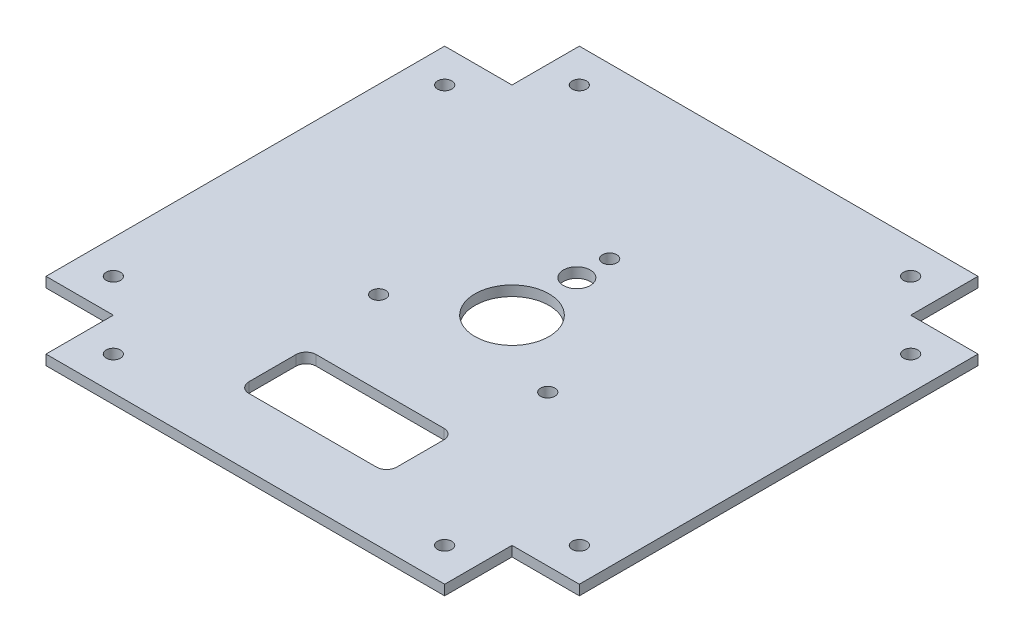
ISO-10303-21;
HEADER;
FILE_DESCRIPTION(('STEP AP214'),'2;1');
FILE_NAME('part.step','',(''),(''),'','','');
FILE_SCHEMA(('AUTOMOTIVE_DESIGN { 1 0 10303 214 1 1 1 1 }'));
ENDSEC;
DATA;
#1=APPLICATION_CONTEXT('core data for automotive mechanical design processes');
#2=APPLICATION_PROTOCOL_DEFINITION('international standard','automotive_design',2000,#1);
#3=PRODUCT_CONTEXT('',#1,'mechanical');
#4=PRODUCT('Part','Part','',(#3));
#5=PRODUCT_RELATED_PRODUCT_CATEGORY('part','',(#4));
#6=PRODUCT_DEFINITION_FORMATION('','',#4);
#7=PRODUCT_DEFINITION_CONTEXT('part definition',#1,'design');
#8=PRODUCT_DEFINITION('design','',#6,#7);
#9=PRODUCT_DEFINITION_SHAPE('','',#8);
#10=(LENGTH_UNIT() NAMED_UNIT(*) SI_UNIT(.MILLI.,.METRE.));
#11=(NAMED_UNIT(*) PLANE_ANGLE_UNIT() SI_UNIT($,.RADIAN.));
#12=(NAMED_UNIT(*) SI_UNIT($,.STERADIAN.) SOLID_ANGLE_UNIT());
#13=UNCERTAINTY_MEASURE_WITH_UNIT(LENGTH_MEASURE(1.E-05),#10,'distance_accuracy_value','');
#14=(GEOMETRIC_REPRESENTATION_CONTEXT(3) GLOBAL_UNCERTAINTY_ASSIGNED_CONTEXT((#13)) GLOBAL_UNIT_ASSIGNED_CONTEXT((#10,
#11,#12)) REPRESENTATION_CONTEXT('',''));
#15=CARTESIAN_POINT('',(0.,0.,0.));
#16=DIRECTION('',(0.,0.,1.));
#17=DIRECTION('',(1.,0.,0.));
#18=AXIS2_PLACEMENT_3D('',#15,#16,#17);
#19=CARTESIAN_POINT('',(79.2,3.,79.2));
#20=DIRECTION('',(-1.,0.,0.));
#21=DIRECTION('',(0.,0.,1.));
#22=AXIS2_PLACEMENT_3D('',#19,#20,#21);
#23=PLANE('',#22);
#24=DIRECTION('',(0.,0.,-1.));
#25=VECTOR('',#24,1.);
#26=CARTESIAN_POINT('',(79.2,3.,79.2));
#27=LINE('',#26,#25);
#28=CARTESIAN_POINT('',(79.2000000000017,3.,59.1999999999984));
#29=VERTEX_POINT('',#28);
#30=CARTESIAN_POINT('',(79.2,3.,-59.2000000000017));
#31=VERTEX_POINT('',#30);
#32=EDGE_CURVE('E202',#29,#31,#27,.T.);
#33=ORIENTED_EDGE('',*,*,#32,.F.);
#34=DIRECTION('',(0.,1.,0.));
#35=VECTOR('',#34,1.);
#36=CARTESIAN_POINT('',(79.2000000000017,0.,59.1999999999984));
#37=LINE('',#36,#35);
#38=CARTESIAN_POINT('',(79.2000000000017,0.,59.1999999999984));
#39=VERTEX_POINT('',#38);
#40=EDGE_CURVE('E547',#39,#29,#37,.T.);
#41=ORIENTED_EDGE('',*,*,#40,.F.);
#42=DIRECTION('',(0.,0.,-1.));
#43=VECTOR('',#42,1.);
#44=CARTESIAN_POINT('',(79.2,0.,79.2));
#45=LINE('',#44,#43);
#46=CARTESIAN_POINT('',(79.2,0.,-59.2000000000017));
#47=VERTEX_POINT('',#46);
#48=EDGE_CURVE('E204',#39,#47,#45,.T.);
#49=ORIENTED_EDGE('',*,*,#48,.T.);
#50=DIRECTION('',(0.,1.,0.));
#51=VECTOR('',#50,1.);
#52=CARTESIAN_POINT('',(79.2,0.,-59.2000000000017));
#53=LINE('',#52,#51);
#54=EDGE_CURVE('E186',#47,#31,#53,.T.);
#55=ORIENTED_EDGE('',*,*,#54,.T.);
#56=EDGE_LOOP('',(#33,#41,#49,#55));
#57=FACE_BOUND('',#56,.T.);
#58=ADVANCED_FACE('F45',(#57),#23,.F.);
#59=CARTESIAN_POINT('',(-79.2,3.,-79.2));
#60=DIRECTION('',(0.,0.,1.));
#61=DIRECTION('',(1.,0.,0.));
#62=AXIS2_PLACEMENT_3D('',#59,#60,#61);
#63=PLANE('',#62);
#64=DIRECTION('',(-1.,0.,0.));
#65=VECTOR('',#64,1.);
#66=CARTESIAN_POINT('',(-79.2,3.,-79.2));
#67=LINE('',#66,#65);
#68=CARTESIAN_POINT('',(59.2,3.,-79.2000000000017));
#69=VERTEX_POINT('',#68);
#70=CARTESIAN_POINT('',(-59.2,3.,-79.2));
#71=VERTEX_POINT('',#70);
#72=EDGE_CURVE('E214',#69,#71,#67,.T.);
#73=ORIENTED_EDGE('',*,*,#72,.F.);
#74=DIRECTION('',(0.,1.,0.));
#75=VECTOR('',#74,1.);
#76=CARTESIAN_POINT('',(59.2,0.,-79.2000000000017));
#77=LINE('',#76,#75);
#78=CARTESIAN_POINT('',(59.2,0.,-79.2000000000017));
#79=VERTEX_POINT('',#78);
#80=EDGE_CURVE('E566',#79,#69,#77,.T.);
#81=ORIENTED_EDGE('',*,*,#80,.F.);
#82=DIRECTION('',(-1.,0.,0.));
#83=VECTOR('',#82,1.);
#84=CARTESIAN_POINT('',(-79.2,0.,-79.2));
#85=LINE('',#84,#83);
#86=CARTESIAN_POINT('',(-59.2,0.,-79.2));
#87=VERTEX_POINT('',#86);
#88=EDGE_CURVE('E238',#79,#87,#85,.T.);
#89=ORIENTED_EDGE('',*,*,#88,.T.);
#90=DIRECTION('',(0.,1.,0.));
#91=VECTOR('',#90,1.);
#92=CARTESIAN_POINT('',(-59.2,0.,-79.2));
#93=LINE('',#92,#91);
#94=EDGE_CURVE('E322',#87,#71,#93,.T.);
#95=ORIENTED_EDGE('',*,*,#94,.T.);
#96=EDGE_LOOP('',(#73,#81,#89,#95));
#97=FACE_BOUND('',#96,.T.);
#98=ADVANCED_FACE('F419',(#97),#63,.F.);
#99=CARTESIAN_POINT('',(-79.2,3.,79.2));
#100=DIRECTION('',(1.,0.,0.));
#101=DIRECTION('',(0.,0.,-1.));
#102=AXIS2_PLACEMENT_3D('',#99,#100,#101);
#103=PLANE('',#102);
#104=DIRECTION('',(0.,0.,1.));
#105=VECTOR('',#104,1.);
#106=CARTESIAN_POINT('',(-79.2,0.,79.2));
#107=LINE('',#106,#105);
#108=CARTESIAN_POINT('',(-79.2,0.,-59.2));
#109=VERTEX_POINT('',#108);
#110=CARTESIAN_POINT('',(-79.1999999999984,0.,59.2));
#111=VERTEX_POINT('',#110);
#112=EDGE_CURVE('E223',#109,#111,#107,.T.);
#113=ORIENTED_EDGE('',*,*,#112,.T.);
#114=DIRECTION('',(0.,1.,0.));
#115=VECTOR('',#114,1.);
#116=CARTESIAN_POINT('',(-79.1999999999984,0.,59.2));
#117=LINE('',#116,#115);
#118=CARTESIAN_POINT('',(-79.1999999999984,3.,59.2));
#119=VERTEX_POINT('',#118);
#120=EDGE_CURVE('E529',#111,#119,#117,.T.);
#121=ORIENTED_EDGE('',*,*,#120,.T.);
#122=DIRECTION('',(0.,0.,1.));
#123=VECTOR('',#122,1.);
#124=CARTESIAN_POINT('',(-79.2,3.,79.2));
#125=LINE('',#124,#123);
#126=CARTESIAN_POINT('',(-79.2,3.,-59.2));
#127=VERTEX_POINT('',#126);
#128=EDGE_CURVE('E220',#127,#119,#125,.T.);
#129=ORIENTED_EDGE('',*,*,#128,.F.);
#130=DIRECTION('',(0.,1.,0.));
#131=VECTOR('',#130,1.);
#132=CARTESIAN_POINT('',(-79.2,0.,-59.2));
#133=LINE('',#132,#131);
#134=EDGE_CURVE('E488',#109,#127,#133,.T.);
#135=ORIENTED_EDGE('',*,*,#134,.F.);
#136=EDGE_LOOP('',(#113,#121,#129,#135));
#137=FACE_BOUND('',#136,.T.);
#138=ADVANCED_FACE('F412',(#137),#103,.F.);
#139=CARTESIAN_POINT('',(-79.2,3.,79.2));
#140=DIRECTION('',(0.,0.,-1.));
#141=DIRECTION('',(-1.,0.,0.));
#142=AXIS2_PLACEMENT_3D('',#139,#140,#141);
#143=PLANE('',#142);
#144=DIRECTION('',(1.,0.,0.));
#145=VECTOR('',#144,1.);
#146=CARTESIAN_POINT('',(-79.2,3.,79.2));
#147=LINE('',#146,#145);
#148=CARTESIAN_POINT('',(-59.1999999999984,3.,79.2));
#149=VERTEX_POINT('',#148);
#150=CARTESIAN_POINT('',(59.2000000000017,3.,79.1999999999984));
#151=VERTEX_POINT('',#150);
#152=EDGE_CURVE('E231',#149,#151,#147,.T.);
#153=ORIENTED_EDGE('',*,*,#152,.F.);
#154=DIRECTION('',(0.,1.,0.));
#155=VECTOR('',#154,1.);
#156=CARTESIAN_POINT('',(-59.1999999999984,0.,79.2));
#157=LINE('',#156,#155);
#158=CARTESIAN_POINT('',(-59.1999999999984,0.,79.2));
#159=VERTEX_POINT('',#158);
#160=EDGE_CURVE('E521',#159,#149,#157,.T.);
#161=ORIENTED_EDGE('',*,*,#160,.F.);
#162=DIRECTION('',(1.,0.,0.));
#163=VECTOR('',#162,1.);
#164=CARTESIAN_POINT('',(-79.2,0.,79.2));
#165=LINE('',#164,#163);
#166=CARTESIAN_POINT('',(59.2000000000017,0.,79.1999999999984));
#167=VERTEX_POINT('',#166);
#168=EDGE_CURVE('E215',#159,#167,#165,.T.);
#169=ORIENTED_EDGE('',*,*,#168,.T.);
#170=DIRECTION('',(0.,1.,0.));
#171=VECTOR('',#170,1.);
#172=CARTESIAN_POINT('',(59.2000000000017,0.,79.1999999999984));
#173=LINE('',#172,#171);
#174=EDGE_CURVE('E526',#167,#151,#173,.T.);
#175=ORIENTED_EDGE('',*,*,#174,.T.);
#176=EDGE_LOOP('',(#153,#161,#169,#175));
#177=FACE_BOUND('',#176,.T.);
#178=ADVANCED_FACE('F402',(#177),#143,.F.);
#179=CARTESIAN_POINT('',(0.,3.,0.));
#180=DIRECTION('',(0.,-1.,0.));
#181=DIRECTION('',(0.,0.,-1.));
#182=AXIS2_PLACEMENT_3D('',#179,#180,#181);
#183=PLANE('',#182);
#184=CARTESIAN_POINT('',(-49.1999999999999,3.,69.1999999999995));
#185=DIRECTION('',(0.,1.,0.));
#186=DIRECTION('',(0.,0.,-1.));
#187=AXIS2_PLACEMENT_3D('',#184,#185,#186);
#188=CIRCLE('',#187,2.12500000000001);
#189=CARTESIAN_POINT('',(-49.1999999999999,3.,67.0749999999994));
#190=VERTEX_POINT('',#189);
#191=EDGE_CURVE('E354',#190,#190,#188,.T.);
#192=ORIENTED_EDGE('',*,*,#191,.F.);
#193=EDGE_LOOP('',(#192));
#194=FACE_BOUND('',#193,.T.);
#195=CARTESIAN_POINT('',(49.2000000000002,3.,69.2));
#196=DIRECTION('',(0.,1.,0.));
#197=DIRECTION('',(0.,0.,1.));
#198=AXIS2_PLACEMENT_3D('',#195,#196,#197);
#199=CIRCLE('',#198,2.125);
#200=CARTESIAN_POINT('',(49.2000000000002,3.,71.325));
#201=VERTEX_POINT('',#200);
#202=EDGE_CURVE('E346',#201,#201,#199,.T.);
#203=ORIENTED_EDGE('',*,*,#202,.F.);
#204=EDGE_LOOP('',(#203));
#205=FACE_BOUND('',#204,.T.);
#206=CARTESIAN_POINT('',(69.1999999999997,3.,49.1999999999996));
#207=DIRECTION('',(0.,1.,0.));
#208=DIRECTION('',(0.,0.,-1.));
#209=AXIS2_PLACEMENT_3D('',#206,#207,#208);
#210=CIRCLE('',#209,2.12499999999999);
#211=CARTESIAN_POINT('',(69.1999999999997,3.,47.0749999999997));
#212=VERTEX_POINT('',#211);
#213=EDGE_CURVE('E338',#212,#212,#210,.T.);
#214=ORIENTED_EDGE('',*,*,#213,.F.);
#215=EDGE_LOOP('',(#214));
#216=FACE_BOUND('',#215,.T.);
#217=CARTESIAN_POINT('',(69.2,3.,-49.2000000000012));
#218=DIRECTION('',(0.,1.,0.));
#219=DIRECTION('',(0.,0.,1.));
#220=AXIS2_PLACEMENT_3D('',#217,#218,#219);
#221=CIRCLE('',#220,2.12500000000035);
#222=CARTESIAN_POINT('',(69.2,3.,-47.0750000000008));
#223=VERTEX_POINT('',#222);
#224=EDGE_CURVE('E329',#223,#223,#221,.T.);
#225=ORIENTED_EDGE('',*,*,#224,.F.);
#226=EDGE_LOOP('',(#225));
#227=FACE_BOUND('',#226,.T.);
#228=CARTESIAN_POINT('',(49.1999999999994,3.,-69.1999999999998));
#229=DIRECTION('',(0.,1.,0.));
#230=DIRECTION('',(0.,0.,-1.));
#231=AXIS2_PLACEMENT_3D('',#228,#229,#230);
#232=CIRCLE('',#231,2.125);
#233=CARTESIAN_POINT('',(49.1999999999994,3.,-71.3249999999998));
#234=VERTEX_POINT('',#233);
#235=EDGE_CURVE('E387',#234,#234,#232,.T.);
#236=ORIENTED_EDGE('',*,*,#235,.F.);
#237=EDGE_LOOP('',(#236));
#238=FACE_BOUND('',#237,.T.);
#239=CARTESIAN_POINT('',(-49.2000000000012,3.,-69.2));
#240=DIRECTION('',(0.,1.,0.));
#241=DIRECTION('',(0.,0.,1.));
#242=AXIS2_PLACEMENT_3D('',#239,#240,#241);
#243=CIRCLE('',#242,2.12500000000047);
#244=CARTESIAN_POINT('',(-49.2000000000012,3.,-67.0749999999995));
#245=VERTEX_POINT('',#244);
#246=EDGE_CURVE('E379',#245,#245,#243,.T.);
#247=ORIENTED_EDGE('',*,*,#246,.F.);
#248=EDGE_LOOP('',(#247));
#249=FACE_BOUND('',#248,.T.);
#250=CARTESIAN_POINT('',(0.,3.,0.));
#251=DIRECTION('',(0.,1.,0.));
#252=DIRECTION('',(0.,0.,1.));
#253=AXIS2_PLACEMENT_3D('',#250,#251,#252);
#254=CIRCLE('',#253,11.);
#255=CARTESIAN_POINT('',(0.,3.,11.));
#256=VERTEX_POINT('',#255);
#257=EDGE_CURVE('E371',#256,#256,#254,.T.);
#258=ORIENTED_EDGE('',*,*,#257,.F.);
#259=EDGE_LOOP('',(#258));
#260=FACE_BOUND('',#259,.T.);
#261=CARTESIAN_POINT('',(-69.2,3.,-49.2000000000012));
#262=DIRECTION('',(0.,1.,0.));
#263=DIRECTION('',(0.,0.,-1.));
#264=AXIS2_PLACEMENT_3D('',#261,#262,#263);
#265=CIRCLE('',#264,2.12500000000057);
#266=CARTESIAN_POINT('',(-69.2,3.,-51.3250000000017));
#267=VERTEX_POINT('',#266);
#268=EDGE_CURVE('E363',#267,#267,#265,.T.);
#269=ORIENTED_EDGE('',*,*,#268,.F.);
#270=EDGE_LOOP('',(#269));
#271=FACE_BOUND('',#270,.T.);
#272=CARTESIAN_POINT('',(0.,3.,-29.));
#273=DIRECTION('',(0.,1.,0.));
#274=DIRECTION('',(0.,0.,1.));
#275=AXIS2_PLACEMENT_3D('',#272,#273,#274);
#276=CIRCLE('',#275,2.125);
#277=CARTESIAN_POINT('',(0.,3.,-26.875));
#278=VERTEX_POINT('',#277);
#279=EDGE_CURVE('E362',#278,#278,#276,.T.);
#280=ORIENTED_EDGE('',*,*,#279,.F.);
#281=EDGE_LOOP('',(#280));
#282=FACE_BOUND('',#281,.T.);
#283=CARTESIAN_POINT('',(0.,3.,-19.25));
#284=DIRECTION('',(0.,1.,0.));
#285=DIRECTION('',(0.,0.,1.));
#286=AXIS2_PLACEMENT_3D('',#283,#284,#285);
#287=CIRCLE('',#286,4.);
#288=CARTESIAN_POINT('',(0.,3.,-15.25));
#289=VERTEX_POINT('',#288);
#290=EDGE_CURVE('E477',#289,#289,#287,.T.);
#291=ORIENTED_EDGE('',*,*,#290,.F.);
#292=EDGE_LOOP('',(#291));
#293=FACE_BOUND('',#292,.T.);
#294=CARTESIAN_POINT('',(25.1147367097506,3.,14.4999999999989));
#295=DIRECTION('',(0.,1.,0.));
#296=DIRECTION('',(0.,0.,1.));
#297=AXIS2_PLACEMENT_3D('',#294,#295,#296);
#298=CIRCLE('',#297,2.12500000000159);
#299=CARTESIAN_POINT('',(25.1147367097506,3.,16.6250000000005));
#300=VERTEX_POINT('',#299);
#301=EDGE_CURVE('E469',#300,#300,#298,.T.);
#302=ORIENTED_EDGE('',*,*,#301,.F.);
#303=EDGE_LOOP('',(#302));
#304=FACE_BOUND('',#303,.T.);
#305=CARTESIAN_POINT('',(-25.1147367097469,3.,14.5000000000011));
#306=DIRECTION('',(0.,1.,0.));
#307=DIRECTION('',(0.,0.,1.));
#308=AXIS2_PLACEMENT_3D('',#305,#306,#307);
#309=CIRCLE('',#308,2.12500000000233);
#310=CARTESIAN_POINT('',(-25.1147367097469,3.,16.6250000000034));
#311=VERTEX_POINT('',#310);
#312=EDGE_CURVE('E454',#311,#311,#309,.T.);
#313=ORIENTED_EDGE('',*,*,#312,.F.);
#314=EDGE_LOOP('',(#313));
#315=FACE_BOUND('',#314,.T.);
#316=DIRECTION('',(-1.,0.,0.));
#317=VECTOR('',#316,1.);
#318=CARTESIAN_POINT('',(-21.955986131949,3.,39.2000000000019));
#319=LINE('',#318,#317);
#320=CARTESIAN_POINT('',(18.9559861319399,3.,39.2000000000019));
#321=VERTEX_POINT('',#320);
#322=CARTESIAN_POINT('',(-18.955986131949,3.,39.2000000000019));
#323=VERTEX_POINT('',#322);
#324=EDGE_CURVE('E293',#321,#323,#319,.T.);
#325=ORIENTED_EDGE('',*,*,#324,.F.);
#326=CARTESIAN_POINT('',(18.9559861319399,3.,42.2000000000019));
#327=DIRECTION('',(0.,-1.,0.));
#328=DIRECTION('',(0.,0.,-1.));
#329=AXIS2_PLACEMENT_3D('',#326,#327,#328);
#330=CIRCLE('',#329,3.);
#331=CARTESIAN_POINT('',(21.9559861319399,3.,42.2000000000019));
#332=VERTEX_POINT('',#331);
#333=EDGE_CURVE('E284',#321,#332,#330,.T.);
#334=ORIENTED_EDGE('',*,*,#333,.T.);
#335=DIRECTION('',(0.,0.,-1.));
#336=VECTOR('',#335,1.);
#337=CARTESIAN_POINT('',(21.9559861319399,3.,59.2000000000019));
#338=LINE('',#337,#336);
#339=CARTESIAN_POINT('',(21.9559861319399,3.,56.2000000000019));
#340=VERTEX_POINT('',#339);
#341=EDGE_CURVE('E301',#340,#332,#338,.T.);
#342=ORIENTED_EDGE('',*,*,#341,.F.);
#343=CARTESIAN_POINT('',(18.9559861319399,3.,56.2000000000019));
#344=DIRECTION('',(0.,-1.,0.));
#345=DIRECTION('',(0.,0.,-1.));
#346=AXIS2_PLACEMENT_3D('',#343,#344,#345);
#347=CIRCLE('',#346,3.);
#348=CARTESIAN_POINT('',(18.9559861319399,3.,59.2000000000019));
#349=VERTEX_POINT('',#348);
#350=EDGE_CURVE('E278',#340,#349,#347,.T.);
#351=ORIENTED_EDGE('',*,*,#350,.T.);
#352=DIRECTION('',(1.,0.,0.));
#353=VECTOR('',#352,1.);
#354=CARTESIAN_POINT('',(-21.955986131949,3.,59.2000000000019));
#355=LINE('',#354,#353);
#356=CARTESIAN_POINT('',(-18.955986131949,3.,59.2000000000019));
#357=VERTEX_POINT('',#356);
#358=EDGE_CURVE('E328',#357,#349,#355,.T.);
#359=ORIENTED_EDGE('',*,*,#358,.F.);
#360=CARTESIAN_POINT('',(-18.955986131949,3.,56.2000000000019));
#361=DIRECTION('',(0.,-1.,0.));
#362=DIRECTION('',(0.,0.,-1.));
#363=AXIS2_PLACEMENT_3D('',#360,#361,#362);
#364=CIRCLE('',#363,3.);
#365=CARTESIAN_POINT('',(-21.955986131949,3.,56.2000000000019));
#366=VERTEX_POINT('',#365);
#367=EDGE_CURVE('E272',#357,#366,#364,.T.);
#368=ORIENTED_EDGE('',*,*,#367,.T.);
#369=DIRECTION('',(0.,0.,1.));
#370=VECTOR('',#369,1.);
#371=CARTESIAN_POINT('',(-21.955986131949,3.,59.2000000000019));
#372=LINE('',#371,#370);
#373=CARTESIAN_POINT('',(-21.955986131949,3.,42.2000000000019));
#374=VERTEX_POINT('',#373);
#375=EDGE_CURVE('E295',#374,#366,#372,.T.);
#376=ORIENTED_EDGE('',*,*,#375,.F.);
#377=CARTESIAN_POINT('',(-18.955986131949,3.,42.2000000000019));
#378=DIRECTION('',(0.,-1.,0.));
#379=DIRECTION('',(0.,0.,-1.));
#380=AXIS2_PLACEMENT_3D('',#377,#378,#379);
#381=CIRCLE('',#380,3.);
#382=EDGE_CURVE('E54',#374,#323,#381,.T.);
#383=ORIENTED_EDGE('',*,*,#382,.T.);
#384=EDGE_LOOP('',(#325,#334,#342,#351,#359,#368,#376,#383));
#385=FACE_BOUND('',#384,.T.);
#386=CARTESIAN_POINT('',(-69.2,3.,49.2000000000012));
#387=DIRECTION('',(0.,1.,0.));
#388=DIRECTION('',(0.,0.,1.));
#389=AXIS2_PLACEMENT_3D('',#386,#387,#388);
#390=CIRCLE('',#389,2.12500000000056);
#391=CARTESIAN_POINT('',(-69.2,3.,51.3250000000017));
#392=VERTEX_POINT('',#391);
#393=EDGE_CURVE('E226',#392,#392,#390,.T.);
#394=ORIENTED_EDGE('',*,*,#393,.F.);
#395=EDGE_LOOP('',(#394));
#396=FACE_BOUND('',#395,.T.);
#397=ORIENTED_EDGE('',*,*,#128,.T.);
#398=DIRECTION('',(-1.,0.,0.));
#399=VECTOR('',#398,1.);
#400=CARTESIAN_POINT('',(-79.1999999999984,3.,59.2));
#401=LINE('',#400,#399);
#402=CARTESIAN_POINT('',(-59.1999999999984,3.,59.2));
#403=VERTEX_POINT('',#402);
#404=EDGE_CURVE('E516',#403,#119,#401,.T.);
#405=ORIENTED_EDGE('',*,*,#404,.F.);
#406=DIRECTION('',(0.,0.,-1.));
#407=VECTOR('',#406,1.);
#408=CARTESIAN_POINT('',(-59.1999999999984,3.,79.2));
#409=LINE('',#408,#407);
#410=EDGE_CURVE('E522',#149,#403,#409,.T.);
#411=ORIENTED_EDGE('',*,*,#410,.F.);
#412=ORIENTED_EDGE('',*,*,#152,.T.);
#413=DIRECTION('',(0.,0.,1.));
#414=VECTOR('',#413,1.);
#415=CARTESIAN_POINT('',(59.2000000000017,3.,79.1999999999984));
#416=LINE('',#415,#414);
#417=CARTESIAN_POINT('',(59.2000000000017,3.,59.1999999999984));
#418=VERTEX_POINT('',#417);
#419=EDGE_CURVE('E542',#418,#151,#416,.T.);
#420=ORIENTED_EDGE('',*,*,#419,.F.);
#421=DIRECTION('',(-1.,0.,0.));
#422=VECTOR('',#421,1.);
#423=CARTESIAN_POINT('',(79.2000000000017,3.,59.1999999999984));
#424=LINE('',#423,#422);
#425=EDGE_CURVE('E206',#29,#418,#424,.T.);
#426=ORIENTED_EDGE('',*,*,#425,.F.);
#427=ORIENTED_EDGE('',*,*,#32,.T.);
#428=DIRECTION('',(1.,0.,0.));
#429=VECTOR('',#428,1.);
#430=CARTESIAN_POINT('',(79.2,3.,-59.2000000000017));
#431=LINE('',#430,#429);
#432=CARTESIAN_POINT('',(59.2,3.,-59.2000000000017));
#433=VERTEX_POINT('',#432);
#434=EDGE_CURVE('E183',#433,#31,#431,.T.);
#435=ORIENTED_EDGE('',*,*,#434,.F.);
#436=DIRECTION('',(0.,0.,1.));
#437=VECTOR('',#436,1.);
#438=CARTESIAN_POINT('',(59.2,3.,-79.2000000000017));
#439=LINE('',#438,#437);
#440=EDGE_CURVE('E195',#69,#433,#439,.T.);
#441=ORIENTED_EDGE('',*,*,#440,.F.);
#442=ORIENTED_EDGE('',*,*,#72,.T.);
#443=DIRECTION('',(0.,0.,-1.));
#444=VECTOR('',#443,1.);
#445=CARTESIAN_POINT('',(-59.2,3.,-79.2));
#446=LINE('',#445,#444);
#447=CARTESIAN_POINT('',(-59.2,3.,-59.2));
#448=VERTEX_POINT('',#447);
#449=EDGE_CURVE('E498',#448,#71,#446,.T.);
#450=ORIENTED_EDGE('',*,*,#449,.F.);
#451=DIRECTION('',(1.,0.,0.));
#452=VECTOR('',#451,1.);
#453=CARTESIAN_POINT('',(-79.2,3.,-59.2));
#454=LINE('',#453,#452);
#455=EDGE_CURVE('E502',#127,#448,#454,.T.);
#456=ORIENTED_EDGE('',*,*,#455,.F.);
#457=EDGE_LOOP('',(#397,#405,#411,#412,#420,#426,#427,#435,#441,#442,#450,#456));
#458=FACE_BOUND('',#457,.T.);
#459=ADVANCED_FACE('F210',(#194,#205,#216,#227,#238,#249,#260,#271,#282,#293,#304,#315,#385,
#396,#458),#183,.F.);
#460=CARTESIAN_POINT('',(0.,0.,0.));
#461=DIRECTION('',(0.,-1.,0.));
#462=DIRECTION('',(0.,0.,-1.));
#463=AXIS2_PLACEMENT_3D('',#460,#461,#462);
#464=PLANE('',#463);
#465=DIRECTION('',(-1.,0.,0.));
#466=VECTOR('',#465,1.);
#467=CARTESIAN_POINT('',(-79.1999999999984,0.,59.2));
#468=LINE('',#467,#466);
#469=CARTESIAN_POINT('',(-59.1999999999984,0.,59.2));
#470=VERTEX_POINT('',#469);
#471=EDGE_CURVE('E517',#470,#111,#468,.T.);
#472=ORIENTED_EDGE('',*,*,#471,.T.);
#473=ORIENTED_EDGE('',*,*,#112,.F.);
#474=DIRECTION('',(1.,0.,0.));
#475=VECTOR('',#474,1.);
#476=CARTESIAN_POINT('',(-79.2,0.,-59.2));
#477=LINE('',#476,#475);
#478=CARTESIAN_POINT('',(-59.2,0.,-59.2));
#479=VERTEX_POINT('',#478);
#480=EDGE_CURVE('E501',#109,#479,#477,.T.);
#481=ORIENTED_EDGE('',*,*,#480,.T.);
#482=DIRECTION('',(0.,0.,-1.));
#483=VECTOR('',#482,1.);
#484=CARTESIAN_POINT('',(-59.2,0.,-79.2));
#485=LINE('',#484,#483);
#486=EDGE_CURVE('E492',#479,#87,#485,.T.);
#487=ORIENTED_EDGE('',*,*,#486,.T.);
#488=ORIENTED_EDGE('',*,*,#88,.F.);
#489=DIRECTION('',(0.,0.,1.));
#490=VECTOR('',#489,1.);
#491=CARTESIAN_POINT('',(59.2,0.,-79.2000000000017));
#492=LINE('',#491,#490);
#493=CARTESIAN_POINT('',(59.2,0.,-59.2000000000017));
#494=VERTEX_POINT('',#493);
#495=EDGE_CURVE('E196',#79,#494,#492,.T.);
#496=ORIENTED_EDGE('',*,*,#495,.T.);
#497=DIRECTION('',(1.,0.,0.));
#498=VECTOR('',#497,1.);
#499=CARTESIAN_POINT('',(79.2,0.,-59.2000000000017));
#500=LINE('',#499,#498);
#501=EDGE_CURVE('E563',#494,#47,#500,.T.);
#502=ORIENTED_EDGE('',*,*,#501,.T.);
#503=ORIENTED_EDGE('',*,*,#48,.F.);
#504=DIRECTION('',(-1.,0.,0.));
#505=VECTOR('',#504,1.);
#506=CARTESIAN_POINT('',(79.2000000000017,0.,59.1999999999984));
#507=LINE('',#506,#505);
#508=CARTESIAN_POINT('',(59.2000000000017,0.,59.1999999999984));
#509=VERTEX_POINT('',#508);
#510=EDGE_CURVE('E538',#39,#509,#507,.T.);
#511=ORIENTED_EDGE('',*,*,#510,.T.);
#512=DIRECTION('',(0.,0.,1.));
#513=VECTOR('',#512,1.);
#514=CARTESIAN_POINT('',(59.2000000000017,0.,79.1999999999984));
#515=LINE('',#514,#513);
#516=EDGE_CURVE('E543',#509,#167,#515,.T.);
#517=ORIENTED_EDGE('',*,*,#516,.T.);
#518=ORIENTED_EDGE('',*,*,#168,.F.);
#519=DIRECTION('',(0.,0.,-1.));
#520=VECTOR('',#519,1.);
#521=CARTESIAN_POINT('',(-59.1999999999984,0.,79.2));
#522=LINE('',#521,#520);
#523=EDGE_CURVE('E512',#159,#470,#522,.T.);
#524=ORIENTED_EDGE('',*,*,#523,.T.);
#525=EDGE_LOOP('',(#472,#473,#481,#487,#488,#496,#502,#503,#511,#517,#518,#524));
#526=FACE_BOUND('',#525,.T.);
#527=CARTESIAN_POINT('',(-49.1999999999999,0.,69.1999999999995));
#528=DIRECTION('',(0.,1.,0.));
#529=DIRECTION('',(0.,0.,-1.));
#530=AXIS2_PLACEMENT_3D('',#527,#528,#529);
#531=CIRCLE('',#530,2.12500000000001);
#532=CARTESIAN_POINT('',(-49.1999999999999,0.,67.0749999999994));
#533=VERTEX_POINT('',#532);
#534=EDGE_CURVE('E358',#533,#533,#531,.T.);
#535=ORIENTED_EDGE('',*,*,#534,.T.);
#536=EDGE_LOOP('',(#535));
#537=FACE_BOUND('',#536,.T.);
#538=CARTESIAN_POINT('',(49.2000000000002,0.,69.2));
#539=DIRECTION('',(0.,1.,0.));
#540=DIRECTION('',(0.,0.,1.));
#541=AXIS2_PLACEMENT_3D('',#538,#539,#540);
#542=CIRCLE('',#541,2.125);
#543=CARTESIAN_POINT('',(49.2000000000002,0.,71.325));
#544=VERTEX_POINT('',#543);
#545=EDGE_CURVE('E350',#544,#544,#542,.T.);
#546=ORIENTED_EDGE('',*,*,#545,.T.);
#547=EDGE_LOOP('',(#546));
#548=FACE_BOUND('',#547,.T.);
#549=CARTESIAN_POINT('',(69.1999999999997,0.,49.1999999999996));
#550=DIRECTION('',(0.,1.,0.));
#551=DIRECTION('',(0.,0.,-1.));
#552=AXIS2_PLACEMENT_3D('',#549,#550,#551);
#553=CIRCLE('',#552,2.12499999999999);
#554=CARTESIAN_POINT('',(69.1999999999997,0.,47.0749999999997));
#555=VERTEX_POINT('',#554);
#556=EDGE_CURVE('E342',#555,#555,#553,.T.);
#557=ORIENTED_EDGE('',*,*,#556,.T.);
#558=EDGE_LOOP('',(#557));
#559=FACE_BOUND('',#558,.T.);
#560=CARTESIAN_POINT('',(69.2,0.,-49.2000000000012));
#561=DIRECTION('',(0.,1.,0.));
#562=DIRECTION('',(0.,0.,1.));
#563=AXIS2_PLACEMENT_3D('',#560,#561,#562);
#564=CIRCLE('',#563,2.12500000000035);
#565=CARTESIAN_POINT('',(69.2,0.,-47.0750000000008));
#566=VERTEX_POINT('',#565);
#567=EDGE_CURVE('E334',#566,#566,#564,.T.);
#568=ORIENTED_EDGE('',*,*,#567,.T.);
#569=EDGE_LOOP('',(#568));
#570=FACE_BOUND('',#569,.T.);
#571=CARTESIAN_POINT('',(49.1999999999994,0.,-69.1999999999998));
#572=DIRECTION('',(0.,1.,0.));
#573=DIRECTION('',(0.,0.,-1.));
#574=AXIS2_PLACEMENT_3D('',#571,#572,#573);
#575=CIRCLE('',#574,2.125);
#576=CARTESIAN_POINT('',(49.1999999999994,0.,-71.3249999999998));
#577=VERTEX_POINT('',#576);
#578=EDGE_CURVE('E333',#577,#577,#575,.T.);
#579=ORIENTED_EDGE('',*,*,#578,.T.);
#580=EDGE_LOOP('',(#579));
#581=FACE_BOUND('',#580,.T.);
#582=CARTESIAN_POINT('',(-49.2000000000012,0.,-69.2));
#583=DIRECTION('',(0.,1.,0.));
#584=DIRECTION('',(0.,0.,1.));
#585=AXIS2_PLACEMENT_3D('',#582,#583,#584);
#586=CIRCLE('',#585,2.12500000000047);
#587=CARTESIAN_POINT('',(-49.2000000000012,0.,-67.0749999999995));
#588=VERTEX_POINT('',#587);
#589=EDGE_CURVE('E383',#588,#588,#586,.T.);
#590=ORIENTED_EDGE('',*,*,#589,.T.);
#591=EDGE_LOOP('',(#590));
#592=FACE_BOUND('',#591,.T.);
#593=CARTESIAN_POINT('',(0.,0.,0.));
#594=DIRECTION('',(0.,1.,0.));
#595=DIRECTION('',(0.,0.,1.));
#596=AXIS2_PLACEMENT_3D('',#593,#594,#595);
#597=CIRCLE('',#596,11.);
#598=CARTESIAN_POINT('',(0.,0.,11.));
#599=VERTEX_POINT('',#598);
#600=EDGE_CURVE('E375',#599,#599,#597,.T.);
#601=ORIENTED_EDGE('',*,*,#600,.T.);
#602=EDGE_LOOP('',(#601));
#603=FACE_BOUND('',#602,.T.);
#604=CARTESIAN_POINT('',(-69.2,0.,-49.2000000000012));
#605=DIRECTION('',(0.,1.,0.));
#606=DIRECTION('',(0.,0.,-1.));
#607=AXIS2_PLACEMENT_3D('',#604,#605,#606);
#608=CIRCLE('',#607,2.12500000000057);
#609=CARTESIAN_POINT('',(-69.2,0.,-51.3250000000017));
#610=VERTEX_POINT('',#609);
#611=EDGE_CURVE('E367',#610,#610,#608,.T.);
#612=ORIENTED_EDGE('',*,*,#611,.T.);
#613=EDGE_LOOP('',(#612));
#614=FACE_BOUND('',#613,.T.);
#615=CARTESIAN_POINT('',(0.,0.,-29.));
#616=DIRECTION('',(0.,1.,0.));
#617=DIRECTION('',(0.,0.,1.));
#618=AXIS2_PLACEMENT_3D('',#615,#616,#617);
#619=CIRCLE('',#618,2.125);
#620=CARTESIAN_POINT('',(0.,0.,-26.875));
#621=VERTEX_POINT('',#620);
#622=EDGE_CURVE('E481',#621,#621,#619,.T.);
#623=ORIENTED_EDGE('',*,*,#622,.T.);
#624=EDGE_LOOP('',(#623));
#625=FACE_BOUND('',#624,.T.);
#626=CARTESIAN_POINT('',(0.,0.,-19.25));
#627=DIRECTION('',(0.,1.,0.));
#628=DIRECTION('',(0.,0.,1.));
#629=AXIS2_PLACEMENT_3D('',#626,#627,#628);
#630=CIRCLE('',#629,4.);
#631=CARTESIAN_POINT('',(0.,0.,-15.25));
#632=VERTEX_POINT('',#631);
#633=EDGE_CURVE('E473',#632,#632,#630,.T.);
#634=ORIENTED_EDGE('',*,*,#633,.T.);
#635=EDGE_LOOP('',(#634));
#636=FACE_BOUND('',#635,.T.);
#637=CARTESIAN_POINT('',(25.1147367097506,0.,14.4999999999989));
#638=DIRECTION('',(0.,1.,0.));
#639=DIRECTION('',(0.,0.,1.));
#640=AXIS2_PLACEMENT_3D('',#637,#638,#639);
#641=CIRCLE('',#640,2.12500000000159);
#642=CARTESIAN_POINT('',(25.1147367097506,0.,16.6250000000005));
#643=VERTEX_POINT('',#642);
#644=EDGE_CURVE('E465',#643,#643,#641,.T.);
#645=ORIENTED_EDGE('',*,*,#644,.T.);
#646=EDGE_LOOP('',(#645));
#647=FACE_BOUND('',#646,.T.);
#648=CARTESIAN_POINT('',(-25.1147367097469,0.,14.5000000000011));
#649=DIRECTION('',(0.,1.,0.));
#650=DIRECTION('',(0.,0.,1.));
#651=AXIS2_PLACEMENT_3D('',#648,#649,#650);
#652=CIRCLE('',#651,2.12500000000233);
#653=CARTESIAN_POINT('',(-25.1147367097469,0.,16.6250000000034));
#654=VERTEX_POINT('',#653);
#655=EDGE_CURVE('E451',#654,#654,#652,.T.);
#656=ORIENTED_EDGE('',*,*,#655,.T.);
#657=EDGE_LOOP('',(#656));
#658=FACE_BOUND('',#657,.T.);
#659=DIRECTION('',(1.,0.,0.));
#660=VECTOR('',#659,1.);
#661=CARTESIAN_POINT('',(-21.955986131949,0.,59.2000000000019));
#662=LINE('',#661,#660);
#663=CARTESIAN_POINT('',(-18.955986131949,0.,59.2000000000019));
#664=VERTEX_POINT('',#663);
#665=CARTESIAN_POINT('',(18.9559861319399,0.,59.2000000000019));
#666=VERTEX_POINT('',#665);
#667=EDGE_CURVE('E316',#664,#666,#662,.T.);
#668=ORIENTED_EDGE('',*,*,#667,.T.);
#669=CARTESIAN_POINT('',(18.9559861319399,0.,56.2000000000019));
#670=DIRECTION('',(0.,-1.,0.));
#671=DIRECTION('',(0.,0.,-1.));
#672=AXIS2_PLACEMENT_3D('',#669,#670,#671);
#673=CIRCLE('',#672,3.);
#674=CARTESIAN_POINT('',(21.9559861319399,0.,56.2000000000019));
#675=VERTEX_POINT('',#674);
#676=EDGE_CURVE('E281',#666,#675,#673,.F.);
#677=ORIENTED_EDGE('',*,*,#676,.T.);
#678=DIRECTION('',(0.,0.,-1.));
#679=VECTOR('',#678,1.);
#680=CARTESIAN_POINT('',(21.9559861319399,0.,59.2000000000019));
#681=LINE('',#680,#679);
#682=CARTESIAN_POINT('',(21.9559861319399,0.,42.2000000000019));
#683=VERTEX_POINT('',#682);
#684=EDGE_CURVE('E320',#675,#683,#681,.T.);
#685=ORIENTED_EDGE('',*,*,#684,.T.);
#686=CARTESIAN_POINT('',(18.9559861319399,0.,42.2000000000019));
#687=DIRECTION('',(0.,-1.,0.));
#688=DIRECTION('',(0.,0.,-1.));
#689=AXIS2_PLACEMENT_3D('',#686,#687,#688);
#690=CIRCLE('',#689,3.);
#691=CARTESIAN_POINT('',(18.9559861319399,0.,39.2000000000019));
#692=VERTEX_POINT('',#691);
#693=EDGE_CURVE('E68',#683,#692,#690,.F.);
#694=ORIENTED_EDGE('',*,*,#693,.T.);
#695=DIRECTION('',(-1.,0.,0.));
#696=VECTOR('',#695,1.);
#697=CARTESIAN_POINT('',(-21.955986131949,0.,39.2000000000019));
#698=LINE('',#697,#696);
#699=CARTESIAN_POINT('',(-18.955986131949,0.,39.2000000000019));
#700=VERTEX_POINT('',#699);
#701=EDGE_CURVE('E311',#692,#700,#698,.T.);
#702=ORIENTED_EDGE('',*,*,#701,.T.);
#703=CARTESIAN_POINT('',(-18.955986131949,0.,42.2000000000019));
#704=DIRECTION('',(0.,-1.,0.));
#705=DIRECTION('',(0.,0.,-1.));
#706=AXIS2_PLACEMENT_3D('',#703,#704,#705);
#707=CIRCLE('',#706,3.);
#708=CARTESIAN_POINT('',(-21.955986131949,0.,42.2000000000019));
#709=VERTEX_POINT('',#708);
#710=EDGE_CURVE('E11',#700,#709,#707,.F.);
#711=ORIENTED_EDGE('',*,*,#710,.T.);
#712=DIRECTION('',(0.,0.,1.));
#713=VECTOR('',#712,1.);
#714=CARTESIAN_POINT('',(-21.955986131949,0.,59.2000000000019));
#715=LINE('',#714,#713);
#716=CARTESIAN_POINT('',(-21.955986131949,0.,56.2000000000019));
#717=VERTEX_POINT('',#716);
#718=EDGE_CURVE('E309',#709,#717,#715,.T.);
#719=ORIENTED_EDGE('',*,*,#718,.T.);
#720=CARTESIAN_POINT('',(-18.955986131949,0.,56.2000000000019));
#721=DIRECTION('',(0.,-1.,0.));
#722=DIRECTION('',(0.,0.,-1.));
#723=AXIS2_PLACEMENT_3D('',#720,#721,#722);
#724=CIRCLE('',#723,3.);
#725=EDGE_CURVE('E275',#717,#664,#724,.F.);
#726=ORIENTED_EDGE('',*,*,#725,.T.);
#727=EDGE_LOOP('',(#668,#677,#685,#694,#702,#711,#719,#726));
#728=FACE_BOUND('',#727,.T.);
#729=CARTESIAN_POINT('',(-69.2,0.,49.2000000000012));
#730=DIRECTION('',(0.,1.,0.));
#731=DIRECTION('',(0.,0.,1.));
#732=AXIS2_PLACEMENT_3D('',#729,#730,#731);
#733=CIRCLE('',#732,2.12500000000056);
#734=CARTESIAN_POINT('',(-69.2,0.,51.3250000000017));
#735=VERTEX_POINT('',#734);
#736=EDGE_CURVE('E239',#735,#735,#733,.T.);
#737=ORIENTED_EDGE('',*,*,#736,.T.);
#738=EDGE_LOOP('',(#737));
#739=FACE_BOUND('',#738,.T.);
#740=ADVANCED_FACE('F307',(#526,#537,#548,#559,#570,#581,#592,#603,#614,#625,#636,#647,#658,
#728,#739),#464,.T.);
#741=CARTESIAN_POINT('',(-69.2,0.,49.2000000000012));
#742=DIRECTION('',(0.,1.,0.));
#743=DIRECTION('',(0.,0.,1.));
#744=AXIS2_PLACEMENT_3D('',#741,#742,#743);
#745=CYLINDRICAL_SURFACE('',#744,2.12500000000056);
#746=ORIENTED_EDGE('',*,*,#736,.F.);
#747=EDGE_LOOP('',(#746));
#748=FACE_BOUND('',#747,.T.);
#749=ORIENTED_EDGE('',*,*,#393,.T.);
#750=EDGE_LOOP('',(#749));
#751=FACE_BOUND('',#750,.T.);
#752=ADVANCED_FACE('F400',(#748,#751),#745,.F.);
#753=CARTESIAN_POINT('',(21.9559861319399,0.,59.2000000000019));
#754=DIRECTION('',(1.,0.,0.));
#755=DIRECTION('',(0.,0.,-1.));
#756=AXIS2_PLACEMENT_3D('',#753,#754,#755);
#757=PLANE('',#756);
#758=ORIENTED_EDGE('',*,*,#684,.F.);
#759=DIRECTION('',(0.,1.,0.));
#760=VECTOR('',#759,1.);
#761=CARTESIAN_POINT('',(21.9559861319399,3.,56.2000000000019));
#762=LINE('',#761,#760);
#763=EDGE_CURVE('E262',#675,#340,#762,.T.);
#764=ORIENTED_EDGE('',*,*,#763,.T.);
#765=ORIENTED_EDGE('',*,*,#341,.T.);
#766=DIRECTION('',(0.,1.,0.));
#767=VECTOR('',#766,1.);
#768=CARTESIAN_POINT('',(21.9559861319399,0.,42.2000000000019));
#769=LINE('',#768,#767);
#770=EDGE_CURVE('E259',#332,#683,#769,.F.);
#771=ORIENTED_EDGE('',*,*,#770,.T.);
#772=EDGE_LOOP('',(#758,#764,#765,#771));
#773=FACE_BOUND('',#772,.T.);
#774=ADVANCED_FACE('F448',(#773),#757,.F.);
#775=CARTESIAN_POINT('',(-21.955986131949,0.,59.2000000000019));
#776=DIRECTION('',(0.,0.,1.));
#777=DIRECTION('',(1.,0.,0.));
#778=AXIS2_PLACEMENT_3D('',#775,#776,#777);
#779=PLANE('',#778);
#780=ORIENTED_EDGE('',*,*,#667,.F.);
#781=DIRECTION('',(0.,1.,0.));
#782=VECTOR('',#781,1.);
#783=CARTESIAN_POINT('',(-18.955986131949,3.,59.2000000000019));
#784=LINE('',#783,#782);
#785=EDGE_CURVE('E248',#664,#357,#784,.T.);
#786=ORIENTED_EDGE('',*,*,#785,.T.);
#787=ORIENTED_EDGE('',*,*,#358,.T.);
#788=DIRECTION('',(0.,1.,0.));
#789=VECTOR('',#788,1.);
#790=CARTESIAN_POINT('',(18.9559861319399,0.,59.2000000000019));
#791=LINE('',#790,#789);
#792=EDGE_CURVE('E235',#349,#666,#791,.F.);
#793=ORIENTED_EDGE('',*,*,#792,.T.);
#794=EDGE_LOOP('',(#780,#786,#787,#793));
#795=FACE_BOUND('',#794,.T.);
#796=ADVANCED_FACE('F639',(#795),#779,.F.);
#797=CARTESIAN_POINT('',(-21.955986131949,0.,59.2000000000019));
#798=DIRECTION('',(-1.,0.,0.));
#799=DIRECTION('',(0.,0.,1.));
#800=AXIS2_PLACEMENT_3D('',#797,#798,#799);
#801=PLANE('',#800);
#802=ORIENTED_EDGE('',*,*,#375,.T.);
#803=DIRECTION('',(0.,1.,0.));
#804=VECTOR('',#803,1.);
#805=CARTESIAN_POINT('',(-21.955986131949,0.,56.2000000000019));
#806=LINE('',#805,#804);
#807=EDGE_CURVE('E256',#366,#717,#806,.F.);
#808=ORIENTED_EDGE('',*,*,#807,.T.);
#809=ORIENTED_EDGE('',*,*,#718,.F.);
#810=DIRECTION('',(0.,1.,0.));
#811=VECTOR('',#810,1.);
#812=CARTESIAN_POINT('',(-21.955986131949,3.,42.2000000000019));
#813=LINE('',#812,#811);
#814=EDGE_CURVE('E252',#709,#374,#813,.T.);
#815=ORIENTED_EDGE('',*,*,#814,.T.);
#816=EDGE_LOOP('',(#802,#808,#809,#815));
#817=FACE_BOUND('',#816,.T.);
#818=ADVANCED_FACE('F313',(#817),#801,.F.);
#819=CARTESIAN_POINT('',(-21.955986131949,0.,39.2000000000019));
#820=DIRECTION('',(0.,0.,-1.));
#821=DIRECTION('',(-1.,0.,0.));
#822=AXIS2_PLACEMENT_3D('',#819,#820,#821);
#823=PLANE('',#822);
#824=ORIENTED_EDGE('',*,*,#701,.F.);
#825=DIRECTION('',(0.,1.,0.));
#826=VECTOR('',#825,1.);
#827=CARTESIAN_POINT('',(18.9559861319399,3.,39.2000000000019));
#828=LINE('',#827,#826);
#829=EDGE_CURVE('E268',#692,#321,#828,.T.);
#830=ORIENTED_EDGE('',*,*,#829,.T.);
#831=ORIENTED_EDGE('',*,*,#324,.T.);
#832=DIRECTION('',(0.,1.,0.));
#833=VECTOR('',#832,1.);
#834=CARTESIAN_POINT('',(-18.955986131949,0.,39.2000000000019));
#835=LINE('',#834,#833);
#836=EDGE_CURVE('E61',#323,#700,#835,.F.);
#837=ORIENTED_EDGE('',*,*,#836,.T.);
#838=EDGE_LOOP('',(#824,#830,#831,#837));
#839=FACE_BOUND('',#838,.T.);
#840=ADVANCED_FACE('F298',(#839),#823,.F.);
#841=CARTESIAN_POINT('',(-25.1147367097469,0.,14.5000000000011));
#842=DIRECTION('',(0.,1.,0.));
#843=DIRECTION('',(0.,0.,1.));
#844=AXIS2_PLACEMENT_3D('',#841,#842,#843);
#845=CYLINDRICAL_SURFACE('',#844,2.12500000000233);
#846=ORIENTED_EDGE('',*,*,#655,.F.);
#847=EDGE_LOOP('',(#846));
#848=FACE_BOUND('',#847,.T.);
#849=ORIENTED_EDGE('',*,*,#312,.T.);
#850=EDGE_LOOP('',(#849));
#851=FACE_BOUND('',#850,.T.);
#852=ADVANCED_FACE('F632',(#848,#851),#845,.F.);
#853=CARTESIAN_POINT('',(25.1147367097506,0.,14.4999999999989));
#854=DIRECTION('',(0.,1.,0.));
#855=DIRECTION('',(0.,0.,1.));
#856=AXIS2_PLACEMENT_3D('',#853,#854,#855);
#857=CYLINDRICAL_SURFACE('',#856,2.12500000000159);
#858=ORIENTED_EDGE('',*,*,#644,.F.);
#859=EDGE_LOOP('',(#858));
#860=FACE_BOUND('',#859,.T.);
#861=ORIENTED_EDGE('',*,*,#301,.T.);
#862=EDGE_LOOP('',(#861));
#863=FACE_BOUND('',#862,.T.);
#864=ADVANCED_FACE('F628',(#860,#863),#857,.F.);
#865=CARTESIAN_POINT('',(0.,0.,-19.25));
#866=DIRECTION('',(0.,1.,0.));
#867=DIRECTION('',(0.,0.,1.));
#868=AXIS2_PLACEMENT_3D('',#865,#866,#867);
#869=CYLINDRICAL_SURFACE('',#868,4.);
#870=ORIENTED_EDGE('',*,*,#633,.F.);
#871=EDGE_LOOP('',(#870));
#872=FACE_BOUND('',#871,.T.);
#873=ORIENTED_EDGE('',*,*,#290,.T.);
#874=EDGE_LOOP('',(#873));
#875=FACE_BOUND('',#874,.T.);
#876=ADVANCED_FACE('F624',(#872,#875),#869,.F.);
#877=CARTESIAN_POINT('',(0.,0.,-29.));
#878=DIRECTION('',(0.,1.,0.));
#879=DIRECTION('',(0.,0.,1.));
#880=AXIS2_PLACEMENT_3D('',#877,#878,#879);
#881=CYLINDRICAL_SURFACE('',#880,2.125);
#882=ORIENTED_EDGE('',*,*,#622,.F.);
#883=EDGE_LOOP('',(#882));
#884=FACE_BOUND('',#883,.T.);
#885=ORIENTED_EDGE('',*,*,#279,.T.);
#886=EDGE_LOOP('',(#885));
#887=FACE_BOUND('',#886,.T.);
#888=ADVANCED_FACE('F620',(#884,#887),#881,.F.);
#889=CARTESIAN_POINT('',(-69.2,0.,-49.2000000000012));
#890=DIRECTION('',(0.,1.,0.));
#891=DIRECTION('',(0.,0.,1.));
#892=AXIS2_PLACEMENT_3D('',#889,#890,#891);
#893=CYLINDRICAL_SURFACE('',#892,2.12500000000057);
#894=ORIENTED_EDGE('',*,*,#611,.F.);
#895=EDGE_LOOP('',(#894));
#896=FACE_BOUND('',#895,.T.);
#897=ORIENTED_EDGE('',*,*,#268,.T.);
#898=EDGE_LOOP('',(#897));
#899=FACE_BOUND('',#898,.T.);
#900=ADVANCED_FACE('F623',(#896,#899),#893,.F.);
#901=CARTESIAN_POINT('',(0.,0.,0.));
#902=DIRECTION('',(0.,1.,0.));
#903=DIRECTION('',(0.,0.,1.));
#904=AXIS2_PLACEMENT_3D('',#901,#902,#903);
#905=CYLINDRICAL_SURFACE('',#904,11.);
#906=ORIENTED_EDGE('',*,*,#600,.F.);
#907=EDGE_LOOP('',(#906));
#908=FACE_BOUND('',#907,.T.);
#909=ORIENTED_EDGE('',*,*,#257,.T.);
#910=EDGE_LOOP('',(#909));
#911=FACE_BOUND('',#910,.T.);
#912=ADVANCED_FACE('F664',(#908,#911),#905,.F.);
#913=CARTESIAN_POINT('',(-49.2000000000012,0.,-69.2));
#914=DIRECTION('',(0.,1.,0.));
#915=DIRECTION('',(0.,0.,1.));
#916=AXIS2_PLACEMENT_3D('',#913,#914,#915);
#917=CYLINDRICAL_SURFACE('',#916,2.12500000000047);
#918=ORIENTED_EDGE('',*,*,#589,.F.);
#919=EDGE_LOOP('',(#918));
#920=FACE_BOUND('',#919,.T.);
#921=ORIENTED_EDGE('',*,*,#246,.T.);
#922=EDGE_LOOP('',(#921));
#923=FACE_BOUND('',#922,.T.);
#924=ADVANCED_FACE('F668',(#920,#923),#917,.F.);
#925=CARTESIAN_POINT('',(49.1999999999994,0.,-69.1999999999998));
#926=DIRECTION('',(0.,1.,0.));
#927=DIRECTION('',(0.,0.,1.));
#928=AXIS2_PLACEMENT_3D('',#925,#926,#927);
#929=CYLINDRICAL_SURFACE('',#928,2.125);
#930=ORIENTED_EDGE('',*,*,#578,.F.);
#931=EDGE_LOOP('',(#930));
#932=FACE_BOUND('',#931,.T.);
#933=ORIENTED_EDGE('',*,*,#235,.T.);
#934=EDGE_LOOP('',(#933));
#935=FACE_BOUND('',#934,.T.);
#936=ADVANCED_FACE('F651',(#932,#935),#929,.F.);
#937=CARTESIAN_POINT('',(69.2,0.,-49.2000000000012));
#938=DIRECTION('',(0.,1.,0.));
#939=DIRECTION('',(0.,0.,1.));
#940=AXIS2_PLACEMENT_3D('',#937,#938,#939);
#941=CYLINDRICAL_SURFACE('',#940,2.12500000000035);
#942=ORIENTED_EDGE('',*,*,#567,.F.);
#943=EDGE_LOOP('',(#942));
#944=FACE_BOUND('',#943,.T.);
#945=ORIENTED_EDGE('',*,*,#224,.T.);
#946=EDGE_LOOP('',(#945));
#947=FACE_BOUND('',#946,.T.);
#948=ADVANCED_FACE('F647',(#944,#947),#941,.F.);
#949=CARTESIAN_POINT('',(69.1999999999997,0.,49.1999999999996));
#950=DIRECTION('',(0.,1.,0.));
#951=DIRECTION('',(0.,0.,1.));
#952=AXIS2_PLACEMENT_3D('',#949,#950,#951);
#953=CYLINDRICAL_SURFACE('',#952,2.12499999999999);
#954=ORIENTED_EDGE('',*,*,#556,.F.);
#955=EDGE_LOOP('',(#954));
#956=FACE_BOUND('',#955,.T.);
#957=ORIENTED_EDGE('',*,*,#213,.T.);
#958=EDGE_LOOP('',(#957));
#959=FACE_BOUND('',#958,.T.);
#960=ADVANCED_FACE('F650',(#956,#959),#953,.F.);
#961=CARTESIAN_POINT('',(49.2000000000002,0.,69.2));
#962=DIRECTION('',(0.,1.,0.));
#963=DIRECTION('',(0.,0.,1.));
#964=AXIS2_PLACEMENT_3D('',#961,#962,#963);
#965=CYLINDRICAL_SURFACE('',#964,2.125);
#966=ORIENTED_EDGE('',*,*,#545,.F.);
#967=EDGE_LOOP('',(#966));
#968=FACE_BOUND('',#967,.T.);
#969=ORIENTED_EDGE('',*,*,#202,.T.);
#970=EDGE_LOOP('',(#969));
#971=FACE_BOUND('',#970,.T.);
#972=ADVANCED_FACE('F655',(#968,#971),#965,.F.);
#973=CARTESIAN_POINT('',(-49.1999999999999,0.,69.1999999999995));
#974=DIRECTION('',(0.,1.,0.));
#975=DIRECTION('',(0.,0.,1.));
#976=AXIS2_PLACEMENT_3D('',#973,#974,#975);
#977=CYLINDRICAL_SURFACE('',#976,2.12500000000001);
#978=ORIENTED_EDGE('',*,*,#534,.F.);
#979=EDGE_LOOP('',(#978));
#980=FACE_BOUND('',#979,.T.);
#981=ORIENTED_EDGE('',*,*,#191,.T.);
#982=EDGE_LOOP('',(#981));
#983=FACE_BOUND('',#982,.T.);
#984=ADVANCED_FACE('F617',(#980,#983),#977,.F.);
#985=CARTESIAN_POINT('',(-59.2,0.,-79.2));
#986=DIRECTION('',(1.,0.,0.));
#987=DIRECTION('',(0.,0.,-1.));
#988=AXIS2_PLACEMENT_3D('',#985,#986,#987);
#989=PLANE('',#988);
#990=ORIENTED_EDGE('',*,*,#449,.T.);
#991=ORIENTED_EDGE('',*,*,#94,.F.);
#992=ORIENTED_EDGE('',*,*,#486,.F.);
#993=DIRECTION('',(0.,1.,0.));
#994=VECTOR('',#993,1.);
#995=CARTESIAN_POINT('',(-59.2,0.,-59.2));
#996=LINE('',#995,#994);
#997=EDGE_CURVE('E491',#479,#448,#996,.T.);
#998=ORIENTED_EDGE('',*,*,#997,.T.);
#999=EDGE_LOOP('',(#990,#991,#992,#998));
#1000=FACE_BOUND('',#999,.T.);
#1001=ADVANCED_FACE('F579',(#1000),#989,.F.);
#1002=CARTESIAN_POINT('',(-79.2,0.,-59.2));
#1003=DIRECTION('',(0.,0.,1.));
#1004=DIRECTION('',(1.,0.,0.));
#1005=AXIS2_PLACEMENT_3D('',#1002,#1003,#1004);
#1006=PLANE('',#1005);
#1007=ORIENTED_EDGE('',*,*,#455,.T.);
#1008=ORIENTED_EDGE('',*,*,#997,.F.);
#1009=ORIENTED_EDGE('',*,*,#480,.F.);
#1010=ORIENTED_EDGE('',*,*,#134,.T.);
#1011=EDGE_LOOP('',(#1007,#1008,#1009,#1010));
#1012=FACE_BOUND('',#1011,.T.);
#1013=ADVANCED_FACE('F585',(#1012),#1006,.F.);
#1014=CARTESIAN_POINT('',(79.2,0.,-59.2000000000017));
#1015=DIRECTION('',(0.,0.,1.));
#1016=DIRECTION('',(1.,0.,0.));
#1017=AXIS2_PLACEMENT_3D('',#1014,#1015,#1016);
#1018=PLANE('',#1017);
#1019=ORIENTED_EDGE('',*,*,#434,.T.);
#1020=ORIENTED_EDGE('',*,*,#54,.F.);
#1021=ORIENTED_EDGE('',*,*,#501,.F.);
#1022=DIRECTION('',(0.,1.,0.));
#1023=VECTOR('',#1022,1.);
#1024=CARTESIAN_POINT('',(59.2,0.,-59.2000000000017));
#1025=LINE('',#1024,#1023);
#1026=EDGE_CURVE('E189',#494,#433,#1025,.T.);
#1027=ORIENTED_EDGE('',*,*,#1026,.T.);
#1028=EDGE_LOOP('',(#1019,#1020,#1021,#1027));
#1029=FACE_BOUND('',#1028,.T.);
#1030=ADVANCED_FACE('F185',(#1029),#1018,.F.);
#1031=CARTESIAN_POINT('',(59.2,0.,-79.2000000000017));
#1032=DIRECTION('',(-1.,0.,0.));
#1033=DIRECTION('',(0.,0.,1.));
#1034=AXIS2_PLACEMENT_3D('',#1031,#1032,#1033);
#1035=PLANE('',#1034);
#1036=ORIENTED_EDGE('',*,*,#440,.T.);
#1037=ORIENTED_EDGE('',*,*,#1026,.F.);
#1038=ORIENTED_EDGE('',*,*,#495,.F.);
#1039=ORIENTED_EDGE('',*,*,#80,.T.);
#1040=EDGE_LOOP('',(#1036,#1037,#1038,#1039));
#1041=FACE_BOUND('',#1040,.T.);
#1042=ADVANCED_FACE('F574',(#1041),#1035,.F.);
#1043=CARTESIAN_POINT('',(59.2000000000017,0.,79.1999999999984));
#1044=DIRECTION('',(-1.,0.,0.));
#1045=DIRECTION('',(0.,0.,1.));
#1046=AXIS2_PLACEMENT_3D('',#1043,#1044,#1045);
#1047=PLANE('',#1046);
#1048=ORIENTED_EDGE('',*,*,#419,.T.);
#1049=ORIENTED_EDGE('',*,*,#174,.F.);
#1050=ORIENTED_EDGE('',*,*,#516,.F.);
#1051=DIRECTION('',(0.,1.,0.));
#1052=VECTOR('',#1051,1.);
#1053=CARTESIAN_POINT('',(59.2000000000017,0.,59.1999999999984));
#1054=LINE('',#1053,#1052);
#1055=EDGE_CURVE('E555',#509,#418,#1054,.T.);
#1056=ORIENTED_EDGE('',*,*,#1055,.T.);
#1057=EDGE_LOOP('',(#1048,#1049,#1050,#1056));
#1058=FACE_BOUND('',#1057,.T.);
#1059=ADVANCED_FACE('F600',(#1058),#1047,.F.);
#1060=CARTESIAN_POINT('',(79.2000000000017,0.,59.1999999999984));
#1061=DIRECTION('',(0.,0.,-1.));
#1062=DIRECTION('',(-1.,0.,0.));
#1063=AXIS2_PLACEMENT_3D('',#1060,#1061,#1062);
#1064=PLANE('',#1063);
#1065=ORIENTED_EDGE('',*,*,#425,.T.);
#1066=ORIENTED_EDGE('',*,*,#1055,.F.);
#1067=ORIENTED_EDGE('',*,*,#510,.F.);
#1068=ORIENTED_EDGE('',*,*,#40,.T.);
#1069=EDGE_LOOP('',(#1065,#1066,#1067,#1068));
#1070=FACE_BOUND('',#1069,.T.);
#1071=ADVANCED_FACE('F602',(#1070),#1064,.F.);
#1072=CARTESIAN_POINT('',(-79.1999999999984,0.,59.2));
#1073=DIRECTION('',(0.,0.,-1.));
#1074=DIRECTION('',(-1.,0.,0.));
#1075=AXIS2_PLACEMENT_3D('',#1072,#1073,#1074);
#1076=PLANE('',#1075);
#1077=ORIENTED_EDGE('',*,*,#404,.T.);
#1078=ORIENTED_EDGE('',*,*,#120,.F.);
#1079=ORIENTED_EDGE('',*,*,#471,.F.);
#1080=DIRECTION('',(0.,1.,0.));
#1081=VECTOR('',#1080,1.);
#1082=CARTESIAN_POINT('',(-59.1999999999984,0.,59.2));
#1083=LINE('',#1082,#1081);
#1084=EDGE_CURVE('E533',#470,#403,#1083,.T.);
#1085=ORIENTED_EDGE('',*,*,#1084,.T.);
#1086=EDGE_LOOP('',(#1077,#1078,#1079,#1085));
#1087=FACE_BOUND('',#1086,.T.);
#1088=ADVANCED_FACE('F593',(#1087),#1076,.F.);
#1089=CARTESIAN_POINT('',(-59.1999999999984,0.,79.2));
#1090=DIRECTION('',(1.,0.,0.));
#1091=DIRECTION('',(0.,0.,-1.));
#1092=AXIS2_PLACEMENT_3D('',#1089,#1090,#1091);
#1093=PLANE('',#1092);
#1094=ORIENTED_EDGE('',*,*,#410,.T.);
#1095=ORIENTED_EDGE('',*,*,#1084,.F.);
#1096=ORIENTED_EDGE('',*,*,#523,.F.);
#1097=ORIENTED_EDGE('',*,*,#160,.T.);
#1098=EDGE_LOOP('',(#1094,#1095,#1096,#1097));
#1099=FACE_BOUND('',#1098,.T.);
#1100=ADVANCED_FACE('F433',(#1099),#1093,.F.);
#1101=CARTESIAN_POINT('',(-18.955986131949,0.,56.2000000000019));
#1102=DIRECTION('',(0.,-1.,0.));
#1103=DIRECTION('',(0.,0.,-1.));
#1104=AXIS2_PLACEMENT_3D('',#1101,#1102,#1103);
#1105=CYLINDRICAL_SURFACE('',#1104,3.);
#1106=ORIENTED_EDGE('',*,*,#725,.F.);
#1107=ORIENTED_EDGE('',*,*,#807,.F.);
#1108=ORIENTED_EDGE('',*,*,#367,.F.);
#1109=ORIENTED_EDGE('',*,*,#785,.F.);
#1110=EDGE_LOOP('',(#1106,#1107,#1108,#1109));
#1111=FACE_BOUND('',#1110,.T.);
#1112=ADVANCED_FACE('F429',(#1111),#1105,.F.);
#1113=CARTESIAN_POINT('',(18.9559861319399,0.,56.2000000000019));
#1114=DIRECTION('',(0.,-1.,0.));
#1115=DIRECTION('',(0.,0.,-1.));
#1116=AXIS2_PLACEMENT_3D('',#1113,#1114,#1115);
#1117=CYLINDRICAL_SURFACE('',#1116,3.);
#1118=ORIENTED_EDGE('',*,*,#676,.F.);
#1119=ORIENTED_EDGE('',*,*,#792,.F.);
#1120=ORIENTED_EDGE('',*,*,#350,.F.);
#1121=ORIENTED_EDGE('',*,*,#763,.F.);
#1122=EDGE_LOOP('',(#1118,#1119,#1120,#1121));
#1123=FACE_BOUND('',#1122,.T.);
#1124=ADVANCED_FACE('F432',(#1123),#1117,.F.);
#1125=CARTESIAN_POINT('',(18.9559861319399,0.,42.2000000000019));
#1126=DIRECTION('',(0.,-1.,0.));
#1127=DIRECTION('',(0.,0.,-1.));
#1128=AXIS2_PLACEMENT_3D('',#1125,#1126,#1127);
#1129=CYLINDRICAL_SURFACE('',#1128,3.);
#1130=ORIENTED_EDGE('',*,*,#693,.F.);
#1131=ORIENTED_EDGE('',*,*,#770,.F.);
#1132=ORIENTED_EDGE('',*,*,#333,.F.);
#1133=ORIENTED_EDGE('',*,*,#829,.F.);
#1134=EDGE_LOOP('',(#1130,#1131,#1132,#1133));
#1135=FACE_BOUND('',#1134,.T.);
#1136=ADVANCED_FACE('F436',(#1135),#1129,.F.);
#1137=CARTESIAN_POINT('',(-18.955986131949,0.,42.2000000000019));
#1138=DIRECTION('',(0.,-1.,0.));
#1139=DIRECTION('',(0.,0.,-1.));
#1140=AXIS2_PLACEMENT_3D('',#1137,#1138,#1139);
#1141=CYLINDRICAL_SURFACE('',#1140,3.);
#1142=ORIENTED_EDGE('',*,*,#710,.F.);
#1143=ORIENTED_EDGE('',*,*,#836,.F.);
#1144=ORIENTED_EDGE('',*,*,#382,.F.);
#1145=ORIENTED_EDGE('',*,*,#814,.F.);
#1146=EDGE_LOOP('',(#1142,#1143,#1144,#1145));
#1147=FACE_BOUND('',#1146,.T.);
#1148=ADVANCED_FACE('F47',(#1147),#1141,.F.);
#1149=CLOSED_SHELL('',(#58,#98,#138,#178,#459,#740,#752,#774,#796,#818,#840,#852,#864,#876,#888,
#900,#912,#924,#936,#948,#960,#972,#984,#1001,#1013,#1030,#1042,#1059,#1071,#1088,#1100,#1112,
#1124,#1136,#1148));
#1150=MANIFOLD_SOLID_BREP('B2',#1149);
#1151=ADVANCED_BREP_SHAPE_REPRESENTATION('',(#18,#1150),#14);
#1152=SHAPE_DEFINITION_REPRESENTATION(#9,#1151);
ENDSEC;
END-ISO-10303-21;
